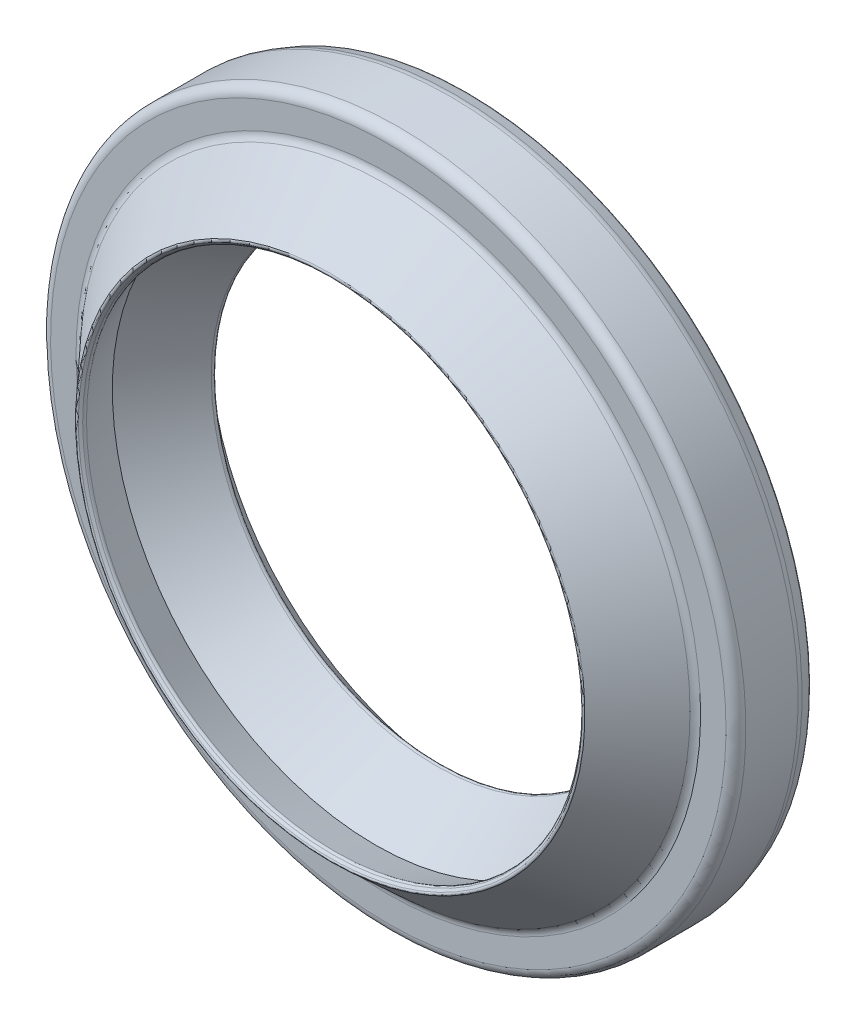
ISO-10303-21;
HEADER;
FILE_DESCRIPTION(('STEP AP214'),'2;1');
FILE_NAME('part.step','',(''),(''),'','','');
FILE_SCHEMA(('AUTOMOTIVE_DESIGN { 1 0 10303 214 1 1 1 1 }'));
ENDSEC;
DATA;
#1=APPLICATION_CONTEXT('core data for automotive mechanical design processes');
#2=APPLICATION_PROTOCOL_DEFINITION('international standard','automotive_design',2000,#1);
#3=PRODUCT_CONTEXT('',#1,'mechanical');
#4=PRODUCT('Part','Part','',(#3));
#5=PRODUCT_RELATED_PRODUCT_CATEGORY('part','',(#4));
#6=PRODUCT_DEFINITION_FORMATION('','',#4);
#7=PRODUCT_DEFINITION_CONTEXT('part definition',#1,'design');
#8=PRODUCT_DEFINITION('design','',#6,#7);
#9=PRODUCT_DEFINITION_SHAPE('','',#8);
#10=(LENGTH_UNIT() NAMED_UNIT(*) SI_UNIT(.MILLI.,.METRE.));
#11=(NAMED_UNIT(*) PLANE_ANGLE_UNIT() SI_UNIT($,.RADIAN.));
#12=(NAMED_UNIT(*) SI_UNIT($,.STERADIAN.) SOLID_ANGLE_UNIT());
#13=UNCERTAINTY_MEASURE_WITH_UNIT(LENGTH_MEASURE(1.E-05),#10,'distance_accuracy_value','');
#14=(GEOMETRIC_REPRESENTATION_CONTEXT(3) GLOBAL_UNCERTAINTY_ASSIGNED_CONTEXT((#13)) GLOBAL_UNIT_ASSIGNED_CONTEXT((#10,
#11,#12)) REPRESENTATION_CONTEXT('',''));
#15=CARTESIAN_POINT('',(0.,0.,0.));
#16=DIRECTION('',(0.,0.,1.));
#17=DIRECTION('',(1.,0.,0.));
#18=AXIS2_PLACEMENT_3D('',#15,#16,#17);
#19=CARTESIAN_POINT('',(0.,0.,1.));
#20=DIRECTION('',(0.,0.,1.));
#21=DIRECTION('',(1.,0.,0.));
#22=AXIS2_PLACEMENT_3D('',#19,#20,#21);
#23=TOROIDAL_SURFACE('',#22,27.5,0.750000000000002);
#24=CARTESIAN_POINT('',(28.25,0.,1.));
#25=VERTEX_POINT('',#24);
#26=VERTEX_LOOP('',#25);
#27=FACE_BOUND('',#26,.T.);
#28=ADVANCED_FACE('F50',(#27),#23,.T.);
#29=CLOSED_SHELL('',(#28));
#30=MANIFOLD_SOLID_BREP('B2',#29);
#31=CARTESIAN_POINT('',(0.,0.,0.));
#32=DIRECTION('',(0.,0.,-1.));
#33=DIRECTION('',(0.,1.,0.));
#34=AXIS2_PLACEMENT_3D('',#31,#32,#33);
#35=CYLINDRICAL_SURFACE('',#34,27.5);
#36=CARTESIAN_POINT('',(0.,0.,6.69999999999999));
#37=DIRECTION('',(0.,0.,-1.));
#38=DIRECTION('',(0.,1.,0.));
#39=AXIS2_PLACEMENT_3D('',#36,#37,#38);
#40=CIRCLE('',#39,27.5);
#41=CARTESIAN_POINT('',(0.,27.5,6.7));
#42=VERTEX_POINT('',#41);
#43=EDGE_CURVE('E70',#42,#42,#40,.T.);
#44=ORIENTED_EDGE('',*,*,#43,.T.);
#45=EDGE_LOOP('',(#44));
#46=FACE_BOUND('',#45,.T.);
#47=CARTESIAN_POINT('',(0.,0.,1.75));
#48=DIRECTION('',(0.,0.,-1.));
#49=DIRECTION('',(0.,1.,0.));
#50=AXIS2_PLACEMENT_3D('',#47,#48,#49);
#51=CIRCLE('',#50,27.5);
#52=CARTESIAN_POINT('',(0.,27.5,1.75));
#53=VERTEX_POINT('',#52);
#54=EDGE_CURVE('E140',#53,#53,#51,.T.);
#55=ORIENTED_EDGE('',*,*,#54,.F.);
#56=EDGE_LOOP('',(#55));
#57=FACE_BOUND('',#56,.T.);
#58=ADVANCED_FACE('F58',(#46,#57),#35,.T.);
#59=CARTESIAN_POINT('',(0.,31.5,7.));
#60=DIRECTION('',(0.,0.,-1.));
#61=DIRECTION('',(0.,1.,0.));
#62=AXIS2_PLACEMENT_3D('',#59,#60,#61);
#63=PLANE('',#62);
#64=CARTESIAN_POINT('',(0.,0.,6.99999999999999));
#65=DIRECTION('',(0.,0.,-1.));
#66=DIRECTION('',(0.,1.,0.));
#67=AXIS2_PLACEMENT_3D('',#64,#65,#66);
#68=CIRCLE('',#67,27.8);
#69=CARTESIAN_POINT('',(0.,27.8,7.));
#70=VERTEX_POINT('',#69);
#71=EDGE_CURVE('E46',#70,#70,#68,.F.);
#72=ORIENTED_EDGE('',*,*,#71,.T.);
#73=EDGE_LOOP('',(#72));
#74=FACE_BOUND('',#73,.T.);
#75=CARTESIAN_POINT('',(0.,0.,7.));
#76=DIRECTION('',(0.,0.,-1.));
#77=DIRECTION('',(0.,1.,0.));
#78=AXIS2_PLACEMENT_3D('',#75,#76,#77);
#79=CIRCLE('',#78,31.);
#80=CARTESIAN_POINT('',(0.,31.,7.));
#81=VERTEX_POINT('',#80);
#82=EDGE_CURVE('E74',#81,#81,#79,.T.);
#83=ORIENTED_EDGE('',*,*,#82,.T.);
#84=EDGE_LOOP('',(#83));
#85=FACE_BOUND('',#84,.T.);
#86=ADVANCED_FACE('F143',(#74,#85),#63,.T.);
#87=CARTESIAN_POINT('',(0.,0.,0.));
#88=DIRECTION('',(0.,0.,-1.));
#89=DIRECTION('',(0.,1.,0.));
#90=AXIS2_PLACEMENT_3D('',#87,#88,#89);
#91=CYLINDRICAL_SURFACE('',#90,31.5);
#92=CARTESIAN_POINT('',(0.,0.,6.5));
#93=DIRECTION('',(0.,0.,-1.));
#94=DIRECTION('',(0.,1.,0.));
#95=AXIS2_PLACEMENT_3D('',#92,#93,#94);
#96=CIRCLE('',#95,31.5);
#97=CARTESIAN_POINT('',(0.,31.5,6.5));
#98=VERTEX_POINT('',#97);
#99=EDGE_CURVE('E73',#98,#98,#96,.F.);
#100=ORIENTED_EDGE('',*,*,#99,.T.);
#101=EDGE_LOOP('',(#100));
#102=FACE_BOUND('',#101,.T.);
#103=CARTESIAN_POINT('',(0.,0.,0.299999999999994));
#104=DIRECTION('',(0.,0.,-1.));
#105=DIRECTION('',(0.,1.,0.));
#106=AXIS2_PLACEMENT_3D('',#103,#104,#105);
#107=CIRCLE('',#106,31.5);
#108=CARTESIAN_POINT('',(0.,31.5,0.299999999999999));
#109=VERTEX_POINT('',#108);
#110=EDGE_CURVE('E82',#109,#109,#107,.T.);
#111=ORIENTED_EDGE('',*,*,#110,.T.);
#112=EDGE_LOOP('',(#111));
#113=FACE_BOUND('',#112,.T.);
#114=ADVANCED_FACE('F152',(#102,#113),#91,.F.);
#115=CARTESIAN_POINT('',(0.,34.5,0.));
#116=DIRECTION('',(0.,0.,-1.));
#117=DIRECTION('',(0.,1.,0.));
#118=AXIS2_PLACEMENT_3D('',#115,#116,#117);
#119=PLANE('',#118);
#120=CARTESIAN_POINT('',(0.,0.,0.));
#121=DIRECTION('',(0.,0.,-1.));
#122=DIRECTION('',(0.,1.,0.));
#123=AXIS2_PLACEMENT_3D('',#120,#121,#122);
#124=CIRCLE('',#123,31.8);
#125=CARTESIAN_POINT('',(0.,31.8,0.));
#126=VERTEX_POINT('',#125);
#127=EDGE_CURVE('E78',#126,#126,#124,.F.);
#128=ORIENTED_EDGE('',*,*,#127,.T.);
#129=EDGE_LOOP('',(#128));
#130=FACE_BOUND('',#129,.T.);
#131=CARTESIAN_POINT('',(0.,0.,0.));
#132=DIRECTION('',(0.,0.,-1.));
#133=DIRECTION('',(0.,1.,0.));
#134=AXIS2_PLACEMENT_3D('',#131,#132,#133);
#135=CIRCLE('',#134,34.2837722339832);
#136=CARTESIAN_POINT('',(0.,34.2837722339832,0.));
#137=VERTEX_POINT('',#136);
#138=EDGE_CURVE('E94',#137,#137,#135,.T.);
#139=ORIENTED_EDGE('',*,*,#138,.T.);
#140=EDGE_LOOP('',(#139));
#141=FACE_BOUND('',#140,.T.);
#142=ADVANCED_FACE('F191',(#130,#141),#119,.T.);
#143=CARTESIAN_POINT('',(0.,0.,0.));
#144=DIRECTION('',(0.,0.,1.));
#145=DIRECTION('',(0.,-1.,0.));
#146=AXIS2_PLACEMENT_3D('',#143,#144,#145);
#147=CONICAL_SURFACE('',#146,34.5,0.321750554396642);
#148=CARTESIAN_POINT('',(0.,0.,1.26907484122732));
#149=DIRECTION('',(0.,0.,-1.));
#150=DIRECTION('',(0.,1.,0.));
#151=AXIS2_PLACEMENT_3D('',#148,#149,#150);
#152=CIRCLE('',#151,34.9230249470758);
#153=CARTESIAN_POINT('',(0.,34.9230249470758,1.26907484122732));
#154=VERTEX_POINT('',#153);
#155=EDGE_CURVE('E89',#154,#154,#152,.T.);
#156=ORIENTED_EDGE('',*,*,#155,.T.);
#157=EDGE_LOOP('',(#156));
#158=FACE_BOUND('',#157,.T.);
#159=CARTESIAN_POINT('',(0.,0.,0.205131670194952));
#160=DIRECTION('',(0.,0.,-1.));
#161=DIRECTION('',(0.,1.,0.));
#162=AXIS2_PLACEMENT_3D('',#159,#160,#161);
#163=CIRCLE('',#162,34.5683772233983);
#164=CARTESIAN_POINT('',(0.,34.5683772233983,0.205131670194958));
#165=VERTEX_POINT('',#164);
#166=EDGE_CURVE('E95',#165,#165,#163,.F.);
#167=ORIENTED_EDGE('',*,*,#166,.T.);
#168=EDGE_LOOP('',(#167));
#169=FACE_BOUND('',#168,.T.);
#170=ADVANCED_FACE('F200',(#158,#169),#147,.T.);
#171=CARTESIAN_POINT('',(0.,0.,0.));
#172=DIRECTION('',(0.,0.,-1.));
#173=DIRECTION('',(0.,1.,0.));
#174=AXIS2_PLACEMENT_3D('',#171,#172,#173);
#175=CYLINDRICAL_SURFACE('',#174,35.);
#176=CARTESIAN_POINT('',(0.,0.,1.74341649025256));
#177=DIRECTION('',(0.,0.,1.));
#178=DIRECTION('',(0.,-1.,0.));
#179=AXIS2_PLACEMENT_3D('',#176,#177,#178);
#180=CIRCLE('',#179,35.);
#181=CARTESIAN_POINT('',(0.,-35.,1.74341649025256));
#182=VERTEX_POINT('',#181);
#183=EDGE_CURVE('E87',#182,#182,#180,.T.);
#184=ORIENTED_EDGE('',*,*,#183,.T.);
#185=EDGE_LOOP('',(#184));
#186=FACE_BOUND('',#185,.T.);
#187=CARTESIAN_POINT('',(0.,0.,7.));
#188=DIRECTION('',(0.,0.,1.));
#189=DIRECTION('',(0.,-1.,0.));
#190=AXIS2_PLACEMENT_3D('',#187,#188,#189);
#191=CIRCLE('',#190,35.);
#192=CARTESIAN_POINT('',(0.,-35.,6.99999999999999));
#193=VERTEX_POINT('',#192);
#194=EDGE_CURVE('E103',#193,#193,#191,.F.);
#195=ORIENTED_EDGE('',*,*,#194,.T.);
#196=EDGE_LOOP('',(#195));
#197=FACE_BOUND('',#196,.T.);
#198=ADVANCED_FACE('F201',(#186,#197),#175,.T.);
#199=CARTESIAN_POINT('',(0.,31.,8.));
#200=DIRECTION('',(0.,0.,1.));
#201=DIRECTION('',(0.,-1.,0.));
#202=AXIS2_PLACEMENT_3D('',#199,#200,#201);
#203=PLANE('',#202);
#204=CARTESIAN_POINT('',(0.,0.,7.99999999999999));
#205=DIRECTION('',(0.,0.,1.));
#206=DIRECTION('',(0.,-1.,0.));
#207=AXIS2_PLACEMENT_3D('',#204,#205,#206);
#208=CIRCLE('',#207,34.);
#209=CARTESIAN_POINT('',(0.,-34.,7.99999999999999));
#210=VERTEX_POINT('',#209);
#211=EDGE_CURVE('E96',#210,#210,#208,.T.);
#212=ORIENTED_EDGE('',*,*,#211,.T.);
#213=EDGE_LOOP('',(#212));
#214=FACE_BOUND('',#213,.T.);
#215=CARTESIAN_POINT('',(0.,0.,7.99999999999999));
#216=DIRECTION('',(0.,0.,1.));
#217=DIRECTION('',(0.,-1.,0.));
#218=AXIS2_PLACEMENT_3D('',#215,#216,#217);
#219=CIRCLE('',#218,31.4399017163416);
#220=CARTESIAN_POINT('',(0.,-31.4399017163416,7.99999999999999));
#221=VERTEX_POINT('',#220);
#222=EDGE_CURVE('E113',#221,#221,#219,.F.);
#223=ORIENTED_EDGE('',*,*,#222,.T.);
#224=EDGE_LOOP('',(#223));
#225=FACE_BOUND('',#224,.T.);
#226=ADVANCED_FACE('F210',(#214,#225),#203,.T.);
#227=CARTESIAN_POINT('',(0.,0.,7.99999999999999));
#228=DIRECTION('',(0.,0.,-1.));
#229=DIRECTION('',(0.,1.,0.));
#230=AXIS2_PLACEMENT_3D('',#227,#228,#229);
#231=CONICAL_SURFACE('',#230,31.,0.741947268005917);
#232=CARTESIAN_POINT('',(0.,0.,13.8460198531419));
#233=DIRECTION('',(0.,0.,1.));
#234=DIRECTION('',(0.,-1.,0.));
#235=AXIS2_PLACEMENT_3D('',#232,#233,#234);
#236=CIRCLE('',#235,25.6411484679532);
#237=CARTESIAN_POINT('',(0.,-25.6411484679532,13.8460198531419));
#238=VERTEX_POINT('',#237);
#239=EDGE_CURVE('E110',#238,#238,#236,.F.);
#240=ORIENTED_EDGE('',*,*,#239,.T.);
#241=EDGE_LOOP('',(#240));
#242=FACE_BOUND('',#241,.T.);
#243=CARTESIAN_POINT('',(0.,0.,8.32427537148265));
#244=DIRECTION('',(0.,0.,-1.));
#245=DIRECTION('',(0.,1.,0.));
#246=AXIS2_PLACEMENT_3D('',#243,#244,#245);
#247=CIRCLE('',#246,30.7027475761409);
#248=CARTESIAN_POINT('',(0.,30.7027475761409,8.32427537148266));
#249=VERTEX_POINT('',#248);
#250=EDGE_CURVE('E109',#249,#249,#247,.F.);
#251=ORIENTED_EDGE('',*,*,#250,.T.);
#252=EDGE_LOOP('',(#251));
#253=FACE_BOUND('',#252,.T.);
#254=ADVANCED_FACE('F211',(#242,#253),#231,.T.);
#255=CARTESIAN_POINT('',(0.,0.,14.));
#256=DIRECTION('',(0.,0.,1.));
#257=DIRECTION('',(0.,-1.,0.));
#258=AXIS2_PLACEMENT_3D('',#255,#256,#257);
#259=CONICAL_SURFACE('',#258,25.5,0.785398163397446);
#260=CARTESIAN_POINT('',(0.,0.,13.8522962836758));
#261=DIRECTION('',(0.,0.,-1.));
#262=DIRECTION('',(0.,1.,0.));
#263=AXIS2_PLACEMENT_3D('',#260,#261,#262);
#264=CIRCLE('',#263,25.3522962836758);
#265=CARTESIAN_POINT('',(0.,25.3522962836758,13.8522962836758));
#266=VERTEX_POINT('',#265);
#267=EDGE_CURVE('E104',#266,#266,#264,.F.);
#268=ORIENTED_EDGE('',*,*,#267,.T.);
#269=EDGE_LOOP('',(#268));
#270=FACE_BOUND('',#269,.T.);
#271=CARTESIAN_POINT('',(0.,0.,13.6340639516467));
#272=DIRECTION('',(0.,0.,-1.));
#273=DIRECTION('',(0.,1.,0.));
#274=AXIS2_PLACEMENT_3D('',#271,#272,#273);
#275=CIRCLE('',#274,25.1340639516467);
#276=CARTESIAN_POINT('',(0.,25.1340639516467,13.6340639516467));
#277=VERTEX_POINT('',#276);
#278=EDGE_CURVE('E116',#277,#277,#275,.T.);
#279=ORIENTED_EDGE('',*,*,#278,.T.);
#280=EDGE_LOOP('',(#279));
#281=FACE_BOUND('',#280,.T.);
#282=ADVANCED_FACE('F214',(#270,#281),#259,.F.);
#283=CARTESIAN_POINT('',(0.,0.,13.4219319172908));
#284=DIRECTION('',(0.,0.,-1.));
#285=DIRECTION('',(0.,1.,0.));
#286=AXIS2_PLACEMENT_3D('',#283,#284,#285);
#287=TOROIDAL_SURFACE('',#286,25.3461959860027,0.299999999999998);
#288=CARTESIAN_POINT('',(0.,0.,13.3213732790602));
#289=DIRECTION('',(0.,0.,-1.));
#290=DIRECTION('',(0.,1.,0.));
#291=AXIS2_PLACEMENT_3D('',#288,#289,#290);
#292=CIRCLE('',#291,25.0635514030417);
#293=CARTESIAN_POINT('',(0.,25.0635514030417,13.3213732790602));
#294=VERTEX_POINT('',#293);
#295=EDGE_CURVE('E118',#294,#294,#292,.T.);
#296=ORIENTED_EDGE('',*,*,#295,.T.);
#297=EDGE_LOOP('',(#296));
#298=FACE_BOUND('',#297,.T.);
#299=ORIENTED_EDGE('',*,*,#278,.F.);
#300=EDGE_LOOP('',(#299));
#301=FACE_BOUND('',#300,.T.);
#302=ADVANCED_FACE('F219',(#298,#301),#287,.T.);
#303=CARTESIAN_POINT('',(0.,0.,13.3213732790602));
#304=DIRECTION('',(0.,0.,-1.));
#305=DIRECTION('',(0.,1.,0.));
#306=AXIS2_PLACEMENT_3D('',#303,#304,#305);
#307=CONICAL_SURFACE('',#306,25.0635514030417,0.341812685226172);
#308=CARTESIAN_POINT('',(0.,0.,9.283884090899));
#309=DIRECTION('',(0.,0.,-1.));
#310=DIRECTION('',(0.,1.,0.));
#311=AXIS2_PLACEMENT_3D('',#308,#309,#310);
#312=CIRCLE('',#311,26.5);
#313=CARTESIAN_POINT('',(0.,26.5,9.283884090899));
#314=VERTEX_POINT('',#313);
#315=EDGE_CURVE('E125',#314,#314,#312,.T.);
#316=ORIENTED_EDGE('',*,*,#315,.T.);
#317=EDGE_LOOP('',(#316));
#318=FACE_BOUND('',#317,.T.);
#319=ORIENTED_EDGE('',*,*,#295,.F.);
#320=EDGE_LOOP('',(#319));
#321=FACE_BOUND('',#320,.T.);
#322=ADVANCED_FACE('F221',(#318,#321),#307,.F.);
#323=CARTESIAN_POINT('',(0.,0.,9.283884090899));
#324=DIRECTION('',(0.,0.,1.));
#325=DIRECTION('',(0.,-1.,0.));
#326=AXIS2_PLACEMENT_3D('',#323,#324,#325);
#327=CONICAL_SURFACE('',#326,26.5,0.567212909200531);
#328=CARTESIAN_POINT('',(0.,0.,3.19957143130245));
#329=DIRECTION('',(0.,0.,-1.));
#330=DIRECTION('',(0.,1.,0.));
#331=AXIS2_PLACEMENT_3D('',#328,#329,#330);
#332=CIRCLE('',#331,22.6240287007763);
#333=CARTESIAN_POINT('',(0.,22.6240287007763,3.19957143130245));
#334=VERTEX_POINT('',#333);
#335=EDGE_CURVE('E123',#334,#334,#332,.T.);
#336=ORIENTED_EDGE('',*,*,#335,.T.);
#337=EDGE_LOOP('',(#336));
#338=FACE_BOUND('',#337,.T.);
#339=ORIENTED_EDGE('',*,*,#315,.F.);
#340=EDGE_LOOP('',(#339));
#341=FACE_BOUND('',#340,.T.);
#342=ADVANCED_FACE('F227',(#338,#341),#327,.F.);
#343=CARTESIAN_POINT('',(0.,0.,3.03838638087824));
#344=DIRECTION('',(0.,0.,-1.));
#345=DIRECTION('',(0.,1.,0.));
#346=AXIS2_PLACEMENT_3D('',#343,#344,#345);
#347=TOROIDAL_SURFACE('',#346,22.8770492128296,0.299999999999998);
#348=CARTESIAN_POINT('',(0.,0.,2.80951305465173));
#349=DIRECTION('',(0.,0.,-1.));
#350=DIRECTION('',(0.,1.,0.));
#351=AXIS2_PLACEMENT_3D('',#348,#349,#350);
#352=CIRCLE('',#351,22.6830981866864);
#353=CARTESIAN_POINT('',(0.,22.6830981866864,2.80951305465173));
#354=VERTEX_POINT('',#353);
#355=EDGE_CURVE('E127',#354,#354,#352,.T.);
#356=ORIENTED_EDGE('',*,*,#355,.T.);
#357=EDGE_LOOP('',(#356));
#358=FACE_BOUND('',#357,.T.);
#359=ORIENTED_EDGE('',*,*,#335,.F.);
#360=EDGE_LOOP('',(#359));
#361=FACE_BOUND('',#360,.T.);
#362=ADVANCED_FACE('F233',(#358,#361),#347,.T.);
#363=CARTESIAN_POINT('',(0.,0.,2.80951305465173));
#364=DIRECTION('',(0.,0.,-1.));
#365=DIRECTION('',(0.,1.,0.));
#366=AXIS2_PLACEMENT_3D('',#363,#364,#365);
#367=CONICAL_SURFACE('',#366,22.6830981866864,0.867804048431517);
#368=CARTESIAN_POINT('',(0.,0.,0.249999999999996));
#369=DIRECTION('',(0.,0.,-1.));
#370=DIRECTION('',(0.,1.,0.));
#371=AXIS2_PLACEMENT_3D('',#368,#369,#370);
#372=CIRCLE('',#371,25.7034702774519);
#373=CARTESIAN_POINT('',(0.,25.7034702774519,0.25));
#374=VERTEX_POINT('',#373);
#375=EDGE_CURVE('E132',#374,#374,#372,.T.);
#376=ORIENTED_EDGE('',*,*,#375,.T.);
#377=EDGE_LOOP('',(#376));
#378=FACE_BOUND('',#377,.T.);
#379=ORIENTED_EDGE('',*,*,#355,.F.);
#380=EDGE_LOOP('',(#379));
#381=FACE_BOUND('',#380,.T.);
#382=ADVANCED_FACE('F232',(#378,#381),#367,.F.);
#383=CARTESIAN_POINT('',(0.,27.5,0.25));
#384=DIRECTION('',(0.,0.,-1.));
#385=DIRECTION('',(0.,1.,0.));
#386=AXIS2_PLACEMENT_3D('',#383,#384,#385);
#387=PLANE('',#386);
#388=CARTESIAN_POINT('',(0.,0.,0.249999999999996));
#389=DIRECTION('',(0.,0.,-1.));
#390=DIRECTION('',(0.,1.,0.));
#391=AXIS2_PLACEMENT_3D('',#388,#389,#390);
#392=CIRCLE('',#391,27.5);
#393=CARTESIAN_POINT('',(0.,27.5,0.25));
#394=VERTEX_POINT('',#393);
#395=EDGE_CURVE('E134',#394,#394,#392,.T.);
#396=ORIENTED_EDGE('',*,*,#395,.T.);
#397=EDGE_LOOP('',(#396));
#398=FACE_BOUND('',#397,.T.);
#399=ORIENTED_EDGE('',*,*,#375,.F.);
#400=EDGE_LOOP('',(#399));
#401=FACE_BOUND('',#400,.T.);
#402=ADVANCED_FACE('F237',(#398,#401),#387,.T.);
#403=CARTESIAN_POINT('',(0.,0.,0.999999999999996));
#404=DIRECTION('',(0.,0.,-1.));
#405=DIRECTION('',(0.,1.,0.));
#406=AXIS2_PLACEMENT_3D('',#403,#404,#405);
#407=TOROIDAL_SURFACE('',#406,27.5,0.75);
#408=ORIENTED_EDGE('',*,*,#54,.T.);
#409=EDGE_LOOP('',(#408));
#410=FACE_BOUND('',#409,.T.);
#411=ORIENTED_EDGE('',*,*,#395,.F.);
#412=EDGE_LOOP('',(#411));
#413=FACE_BOUND('',#412,.T.);
#414=ADVANCED_FACE('F142',(#410,#413),#407,.F.);
#415=CARTESIAN_POINT('',(0.,0.,9.));
#416=DIRECTION('',(0.,0.,1.));
#417=DIRECTION('',(0.,-1.,0.));
#418=AXIS2_PLACEMENT_3D('',#415,#416,#417);
#419=TOROIDAL_SURFACE('',#418,31.4399017163416,1.);
#420=ORIENTED_EDGE('',*,*,#250,.F.);
#421=EDGE_LOOP('',(#420));
#422=FACE_BOUND('',#421,.T.);
#423=ORIENTED_EDGE('',*,*,#222,.F.);
#424=EDGE_LOOP('',(#423));
#425=FACE_BOUND('',#424,.T.);
#426=ADVANCED_FACE('F151',(#422,#425),#419,.F.);
#427=CARTESIAN_POINT('',(0.,0.,13.7108749274385));
#428=DIRECTION('',(0.,0.,1.));
#429=DIRECTION('',(0.,-1.,0.));
#430=AXIS2_PLACEMENT_3D('',#427,#428,#429);
#431=TOROIDAL_SURFACE('',#430,25.4937176399131,0.2);
#432=ORIENTED_EDGE('',*,*,#267,.F.);
#433=EDGE_LOOP('',(#432));
#434=FACE_BOUND('',#433,.T.);
#435=ORIENTED_EDGE('',*,*,#239,.F.);
#436=EDGE_LOOP('',(#435));
#437=FACE_BOUND('',#436,.T.);
#438=ADVANCED_FACE('F156',(#434,#437),#431,.T.);
#439=CARTESIAN_POINT('',(0.,0.,7.));
#440=DIRECTION('',(0.,0.,1.));
#441=DIRECTION('',(0.,-1.,0.));
#442=AXIS2_PLACEMENT_3D('',#439,#440,#441);
#443=TOROIDAL_SURFACE('',#442,34.,1.);
#444=ORIENTED_EDGE('',*,*,#211,.F.);
#445=EDGE_LOOP('',(#444));
#446=FACE_BOUND('',#445,.T.);
#447=ORIENTED_EDGE('',*,*,#194,.F.);
#448=EDGE_LOOP('',(#447));
#449=FACE_BOUND('',#448,.T.);
#450=ADVANCED_FACE('F162',(#446,#449),#443,.T.);
#451=CARTESIAN_POINT('',(0.,0.,0.299999999999994));
#452=DIRECTION('',(0.,0.,-1.));
#453=DIRECTION('',(0.,1.,0.));
#454=AXIS2_PLACEMENT_3D('',#451,#452,#453);
#455=TOROIDAL_SURFACE('',#454,34.2837722339832,0.3);
#456=ORIENTED_EDGE('',*,*,#166,.F.);
#457=EDGE_LOOP('',(#456));
#458=FACE_BOUND('',#457,.T.);
#459=ORIENTED_EDGE('',*,*,#138,.F.);
#460=EDGE_LOOP('',(#459));
#461=FACE_BOUND('',#460,.T.);
#462=ADVANCED_FACE('F168',(#458,#461),#455,.T.);
#463=CARTESIAN_POINT('',(0.,0.,1.74341649025256));
#464=DIRECTION('',(0.,0.,1.));
#465=DIRECTION('',(0.,-1.,0.));
#466=AXIS2_PLACEMENT_3D('',#463,#464,#465);
#467=TOROIDAL_SURFACE('',#466,33.5,1.5);
#468=ORIENTED_EDGE('',*,*,#183,.F.);
#469=EDGE_LOOP('',(#468));
#470=FACE_BOUND('',#469,.T.);
#471=ORIENTED_EDGE('',*,*,#155,.F.);
#472=EDGE_LOOP('',(#471));
#473=FACE_BOUND('',#472,.T.);
#474=ADVANCED_FACE('F167',(#470,#473),#467,.T.);
#475=CARTESIAN_POINT('',(0.,0.,0.299999999999994));
#476=DIRECTION('',(0.,0.,-1.));
#477=DIRECTION('',(0.,1.,0.));
#478=AXIS2_PLACEMENT_3D('',#475,#476,#477);
#479=TOROIDAL_SURFACE('',#478,31.8,0.3);
#480=ORIENTED_EDGE('',*,*,#127,.F.);
#481=EDGE_LOOP('',(#480));
#482=FACE_BOUND('',#481,.T.);
#483=ORIENTED_EDGE('',*,*,#110,.F.);
#484=EDGE_LOOP('',(#483));
#485=FACE_BOUND('',#484,.T.);
#486=ADVANCED_FACE('F172',(#482,#485),#479,.T.);
#487=CARTESIAN_POINT('',(0.,0.,6.5));
#488=DIRECTION('',(0.,0.,-1.));
#489=DIRECTION('',(0.,1.,0.));
#490=AXIS2_PLACEMENT_3D('',#487,#488,#489);
#491=TOROIDAL_SURFACE('',#490,31.,0.5);
#492=ORIENTED_EDGE('',*,*,#99,.F.);
#493=EDGE_LOOP('',(#492));
#494=FACE_BOUND('',#493,.T.);
#495=ORIENTED_EDGE('',*,*,#82,.F.);
#496=EDGE_LOOP('',(#495));
#497=FACE_BOUND('',#496,.T.);
#498=ADVANCED_FACE('F180',(#494,#497),#491,.F.);
#499=CARTESIAN_POINT('',(0.,0.,6.69999999999999));
#500=DIRECTION('',(0.,0.,-1.));
#501=DIRECTION('',(0.,1.,0.));
#502=AXIS2_PLACEMENT_3D('',#499,#500,#501);
#503=TOROIDAL_SURFACE('',#502,27.8,0.3);
#504=ORIENTED_EDGE('',*,*,#71,.F.);
#505=EDGE_LOOP('',(#504));
#506=FACE_BOUND('',#505,.T.);
#507=ORIENTED_EDGE('',*,*,#43,.F.);
#508=EDGE_LOOP('',(#507));
#509=FACE_BOUND('',#508,.T.);
#510=ADVANCED_FACE('F65',(#506,#509),#503,.F.);
#511=CLOSED_SHELL('',(#58,#86,#114,#142,#170,#198,#226,#254,#282,#302,#322,#342,#362,#382,#402,
#414,#426,#438,#450,#462,#474,#486,#498,#510));
#512=MANIFOLD_SOLID_BREP('B6',#511);
#513=ADVANCED_BREP_SHAPE_REPRESENTATION('',(#18,#30,#512),#14);
#514=SHAPE_DEFINITION_REPRESENTATION(#9,#513);
ENDSEC;
END-ISO-10303-21;
